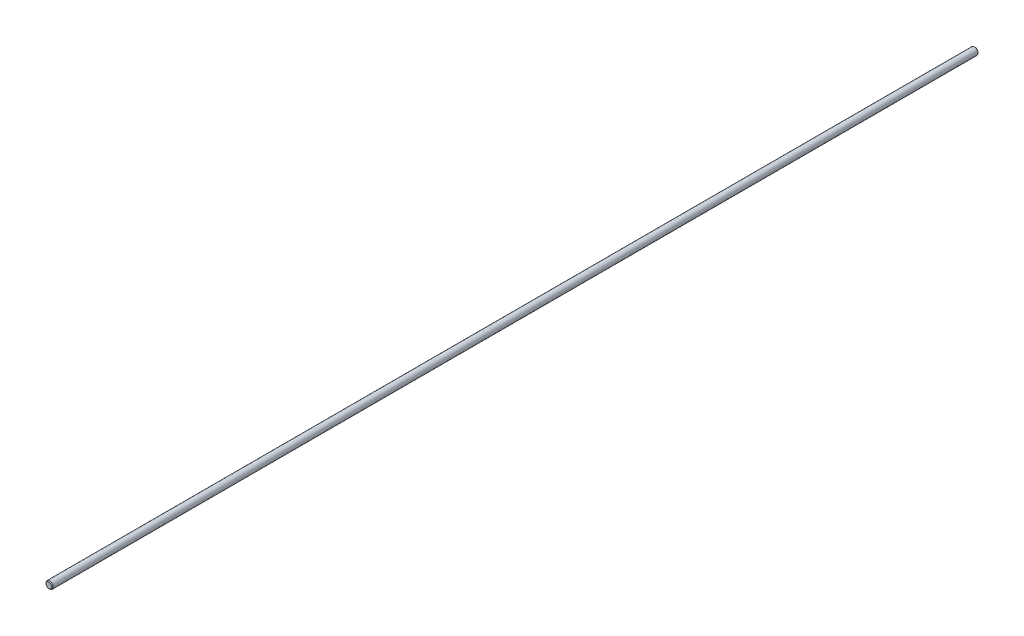
ISO-10303-21;
HEADER;
FILE_DESCRIPTION(('STEP AP214'),'2;1');
FILE_NAME('part.step','',(''),(''),'','','');
FILE_SCHEMA(('AUTOMOTIVE_DESIGN { 1 0 10303 214 1 1 1 1 }'));
ENDSEC;
DATA;
#1=APPLICATION_CONTEXT('core data for automotive mechanical design processes');
#2=APPLICATION_PROTOCOL_DEFINITION('international standard','automotive_design',2000,#1);
#3=PRODUCT_CONTEXT('',#1,'mechanical');
#4=PRODUCT('Part','Part','',(#3));
#5=PRODUCT_RELATED_PRODUCT_CATEGORY('part','',(#4));
#6=PRODUCT_DEFINITION_FORMATION('','',#4);
#7=PRODUCT_DEFINITION_CONTEXT('part definition',#1,'design');
#8=PRODUCT_DEFINITION('design','',#6,#7);
#9=PRODUCT_DEFINITION_SHAPE('','',#8);
#10=(LENGTH_UNIT() NAMED_UNIT(*) SI_UNIT(.MILLI.,.METRE.));
#11=(NAMED_UNIT(*) PLANE_ANGLE_UNIT() SI_UNIT($,.RADIAN.));
#12=(NAMED_UNIT(*) SI_UNIT($,.STERADIAN.) SOLID_ANGLE_UNIT());
#13=UNCERTAINTY_MEASURE_WITH_UNIT(LENGTH_MEASURE(1.E-05),#10,'distance_accuracy_value','');
#14=(GEOMETRIC_REPRESENTATION_CONTEXT(3) GLOBAL_UNCERTAINTY_ASSIGNED_CONTEXT((#13)) GLOBAL_UNIT_ASSIGNED_CONTEXT((#10,
#11,#12)) REPRESENTATION_CONTEXT('',''));
#15=CARTESIAN_POINT('',(0.,0.,0.));
#16=DIRECTION('',(0.,0.,1.));
#17=DIRECTION('',(1.,0.,0.));
#18=AXIS2_PLACEMENT_3D('',#15,#16,#17);
#19=CARTESIAN_POINT('',(0.,0.,152.4));
#20=DIRECTION('',(0.,0.,-1.));
#21=DIRECTION('',(-1.,0.,0.));
#22=AXIS2_PLACEMENT_3D('',#19,#20,#21);
#23=CYLINDRICAL_SURFACE('',#22,1.190625);
#24=CARTESIAN_POINT('',(0.,0.,152.161875));
#25=DIRECTION('',(0.,0.,1.));
#26=DIRECTION('',(1.,0.,0.));
#27=AXIS2_PLACEMENT_3D('',#24,#25,#26);
#28=CIRCLE('',#27,1.190625);
#29=CARTESIAN_POINT('',(-1.190625,0.,152.161875));
#30=VERTEX_POINT('',#29);
#31=EDGE_CURVE('E37',#30,#30,#28,.F.);
#32=CARTESIAN_POINT('',(0.,0.,-152.161875));
#33=DIRECTION('',(0.,0.,1.));
#34=DIRECTION('',(1.,0.,0.));
#35=AXIS2_PLACEMENT_3D('',#32,#33,#34);
#36=CIRCLE('',#35,1.190625);
#37=CARTESIAN_POINT('',(-1.190625,0.,-152.161875));
#38=VERTEX_POINT('',#37);
#39=EDGE_CURVE('E41',#38,#38,#36,.T.);
#40=CARTESIAN_POINT('',(-1.190625,0.,152.161875));
#41=CARTESIAN_POINT('',(-1.190625,0.,148.9918359375));
#42=CARTESIAN_POINT('',(-1.190625,0.,145.821796875));
#43=CARTESIAN_POINT('',(-1.190625,0.,139.48171875));
#44=CARTESIAN_POINT('',(-1.190625,0.,136.3116796875));
#45=CARTESIAN_POINT('',(-1.190625,0.,129.9716015625));
#46=CARTESIAN_POINT('',(-1.190625,0.,126.8015625));
#47=CARTESIAN_POINT('',(-1.190625,0.,120.461484375));
#48=CARTESIAN_POINT('',(-1.190625,0.,117.2914453125));
#49=CARTESIAN_POINT('',(-1.190625,0.,110.9513671875));
#50=CARTESIAN_POINT('',(-1.190625,0.,107.781328125));
#51=CARTESIAN_POINT('',(-1.190625,0.,101.44125));
#52=CARTESIAN_POINT('',(-1.190625,0.,98.2712109375001));
#53=CARTESIAN_POINT('',(-1.190625,0.,91.9311328125001));
#54=CARTESIAN_POINT('',(-1.190625,0.,88.7610937500001));
#55=CARTESIAN_POINT('',(-1.190625,0.,82.4210156250001));
#56=CARTESIAN_POINT('',(-1.190625,0.,79.2509765625001));
#57=CARTESIAN_POINT('',(-1.190625,0.,72.9108984375001));
#58=CARTESIAN_POINT('',(-1.190625,0.,69.7408593750001));
#59=CARTESIAN_POINT('',(-1.190625,0.,63.4007812500001));
#60=CARTESIAN_POINT('',(-1.190625,0.,60.2307421875001));
#61=CARTESIAN_POINT('',(-1.190625,0.,53.8906640625001));
#62=CARTESIAN_POINT('',(-1.190625,0.,50.7206250000001));
#63=CARTESIAN_POINT('',(-1.190625,0.,44.3805468750001));
#64=CARTESIAN_POINT('',(-1.190625,0.,41.2105078125001));
#65=CARTESIAN_POINT('',(-1.190625,0.,34.8704296875001));
#66=CARTESIAN_POINT('',(-1.190625,0.,31.7003906250001));
#67=CARTESIAN_POINT('',(-1.190625,0.,25.3603125000001));
#68=CARTESIAN_POINT('',(-1.190625,0.,22.1902734375001));
#69=CARTESIAN_POINT('',(-1.190625,0.,15.8501953125001));
#70=CARTESIAN_POINT('',(-1.190625,0.,12.6801562500001));
#71=CARTESIAN_POINT('',(-1.190625,0.,6.34007812500011));
#72=CARTESIAN_POINT('',(-1.190625,0.,3.17003906250011));
#73=CARTESIAN_POINT('',(-1.190625,0.,-3.17003906249989));
#74=CARTESIAN_POINT('',(-1.190625,0.,-6.34007812499989));
#75=CARTESIAN_POINT('',(-1.190625,0.,-12.6801562499999));
#76=CARTESIAN_POINT('',(-1.190625,0.,-15.8501953124999));
#77=CARTESIAN_POINT('',(-1.190625,0.,-22.1902734374999));
#78=CARTESIAN_POINT('',(-1.190625,0.,-25.3603124999999));
#79=CARTESIAN_POINT('',(-1.190625,0.,-31.7003906249999));
#80=CARTESIAN_POINT('',(-1.190625,0.,-34.8704296874999));
#81=CARTESIAN_POINT('',(-1.190625,0.,-41.2105078124999));
#82=CARTESIAN_POINT('',(-1.190625,0.,-44.3805468749999));
#83=CARTESIAN_POINT('',(-1.190625,0.,-50.7206249999999));
#84=CARTESIAN_POINT('',(-1.190625,0.,-53.8906640624999));
#85=CARTESIAN_POINT('',(-1.190625,0.,-60.2307421874999));
#86=CARTESIAN_POINT('',(-1.190625,0.,-63.4007812499999));
#87=CARTESIAN_POINT('',(-1.190625,0.,-69.7408593749999));
#88=CARTESIAN_POINT('',(-1.190625,0.,-72.9108984374999));
#89=CARTESIAN_POINT('',(-1.190625,0.,-79.2509765624998));
#90=CARTESIAN_POINT('',(-1.190625,0.,-82.4210156249998));
#91=CARTESIAN_POINT('',(-1.190625,0.,-88.7610937499998));
#92=CARTESIAN_POINT('',(-1.190625,0.,-91.9311328124998));
#93=CARTESIAN_POINT('',(-1.190625,0.,-98.2712109374998));
#94=CARTESIAN_POINT('',(-1.190625,0.,-101.44125));
#95=CARTESIAN_POINT('',(-1.190625,0.,-107.781328125));
#96=CARTESIAN_POINT('',(-1.190625,0.,-110.9513671875));
#97=CARTESIAN_POINT('',(-1.190625,0.,-117.2914453125));
#98=CARTESIAN_POINT('',(-1.190625,0.,-120.461484375));
#99=CARTESIAN_POINT('',(-1.190625,0.,-126.8015625));
#100=CARTESIAN_POINT('',(-1.190625,0.,-129.9716015625));
#101=CARTESIAN_POINT('',(-1.190625,0.,-136.3116796875));
#102=CARTESIAN_POINT('',(-1.190625,0.,-139.48171875));
#103=CARTESIAN_POINT('',(-1.190625,0.,-145.821796875));
#104=CARTESIAN_POINT('',(-1.190625,0.,-148.9918359375));
#105=CARTESIAN_POINT('',(-1.190625,0.,-152.161875));
#106=B_SPLINE_CURVE_WITH_KNOTS('',3,(#40,#41,#42,#43,#44,#45,#46,#47,#48,#49,#50,#51,#52,#53,
#54,#55,#56,#57,#58,#59,#60,#61,#62,#63,#64,#65,#66,#67,#68,#69,#70,#71,#72,#73,#74,#75,#76,#77,
#78,#79,#80,#81,#82,#83,#84,#85,#86,#87,#88,#89,#90,#91,#92,#93,#94,#95,#96,#97,#98,#99,#100,
#101,#102,#103,#104,#105),.UNSPECIFIED.,.F.,.F.,(4,2,2,2,2,2,2,2,2,2,2,2,2,2,2,2,2,2,2,2,2,2,2,
2,2,2,2,2,2,2,2,2,4),(0.,9.5101171875,19.020234375,28.5303515625,38.04046875,47.5505859375,
57.060703125,66.5708203125,76.0809375,85.5910546875,95.101171875,104.6112890625,114.12140625,
123.6315234375,133.141640625,142.6517578125,152.161875,161.6719921875,171.182109375,
180.6922265625,190.20234375,199.7124609375,209.222578125,218.7326953125,228.2428125,
237.7529296875,247.263046875,256.7731640625,266.28328125,275.7933984375,285.303515625,
294.8136328125,304.32375),.UNSPECIFIED.);
#107=EDGE_CURVE('BSEAM30',#30,#38,#106,.T.);
#108=ORIENTED_EDGE('',*,*,#31,.T.);
#109=ORIENTED_EDGE('',*,*,#39,.T.);
#110=ORIENTED_EDGE('',*,*,#107,.T.);
#111=ORIENTED_EDGE('',*,*,#107,.F.);
#112=EDGE_LOOP('',(#108,#110,#109,#111));
#113=FACE_BOUND('',#112,.T.);
#114=ADVANCED_FACE('F30',(#113),#23,.T.);
#115=CARTESIAN_POINT('',(0.,0.,152.4));
#116=DIRECTION('',(0.,0.,1.));
#117=DIRECTION('',(1.,0.,0.));
#118=AXIS2_PLACEMENT_3D('',#115,#116,#117);
#119=PLANE('',#118);
#120=CARTESIAN_POINT('',(0.,0.,152.4));
#121=DIRECTION('',(0.,0.,1.));
#122=DIRECTION('',(1.,0.,0.));
#123=AXIS2_PLACEMENT_3D('',#120,#121,#122);
#124=CIRCLE('',#123,0.952500000000078);
#125=CARTESIAN_POINT('',(0.952500000000078,0.,152.4));
#126=VERTEX_POINT('',#125);
#127=EDGE_CURVE('E45',#126,#126,#124,.T.);
#128=ORIENTED_EDGE('',*,*,#127,.T.);
#129=EDGE_LOOP('',(#128));
#130=FACE_BOUND('',#129,.T.);
#131=ADVANCED_FACE('F51',(#130),#119,.T.);
#132=CARTESIAN_POINT('',(0.,0.,-152.4));
#133=DIRECTION('',(0.,0.,1.));
#134=DIRECTION('',(1.,0.,0.));
#135=AXIS2_PLACEMENT_3D('',#132,#133,#134);
#136=PLANE('',#135);
#137=CARTESIAN_POINT('',(0.,0.,-152.4));
#138=DIRECTION('',(0.,0.,1.));
#139=DIRECTION('',(1.,0.,0.));
#140=AXIS2_PLACEMENT_3D('',#137,#138,#139);
#141=CIRCLE('',#140,0.952499999999717);
#142=CARTESIAN_POINT('',(0.952499999999717,0.,-152.4));
#143=VERTEX_POINT('',#142);
#144=EDGE_CURVE('E10',#143,#143,#141,.F.);
#145=ORIENTED_EDGE('',*,*,#144,.T.);
#146=EDGE_LOOP('',(#145));
#147=FACE_BOUND('',#146,.T.);
#148=ADVANCED_FACE('F55',(#147),#136,.F.);
#149=CARTESIAN_POINT('',(0.,0.,152.4));
#150=DIRECTION('',(0.,0.,-1.));
#151=DIRECTION('',(-1.,0.,0.));
#152=AXIS2_PLACEMENT_3D('',#149,#150,#151);
#153=CONICAL_SURFACE('',#152,0.952500000000078,0.785398163397447);
#154=ORIENTED_EDGE('',*,*,#31,.F.);
#155=EDGE_LOOP('',(#154));
#156=FACE_BOUND('',#155,.T.);
#157=ORIENTED_EDGE('',*,*,#127,.F.);
#158=EDGE_LOOP('',(#157));
#159=FACE_BOUND('',#158,.T.);
#160=ADVANCED_FACE('F53',(#156,#159),#153,.T.);
#161=CARTESIAN_POINT('',(0.,0.,-152.161875));
#162=DIRECTION('',(0.,0.,1.));
#163=DIRECTION('',(1.,0.,0.));
#164=AXIS2_PLACEMENT_3D('',#161,#162,#163);
#165=CONICAL_SURFACE('',#164,1.190625,0.785398163397506);
#166=ORIENTED_EDGE('',*,*,#144,.F.);
#167=EDGE_LOOP('',(#166));
#168=FACE_BOUND('',#167,.T.);
#169=ORIENTED_EDGE('',*,*,#39,.F.);
#170=EDGE_LOOP('',(#169));
#171=FACE_BOUND('',#170,.T.);
#172=ADVANCED_FACE('F32',(#168,#171),#165,.T.);
#173=CLOSED_SHELL('',(#114,#131,#148,#160,#172));
#174=MANIFOLD_SOLID_BREP('B2',#173);
#175=ADVANCED_BREP_SHAPE_REPRESENTATION('',(#18,#174),#14);
#176=SHAPE_DEFINITION_REPRESENTATION(#9,#175);
ENDSEC;
END-ISO-10303-21;
